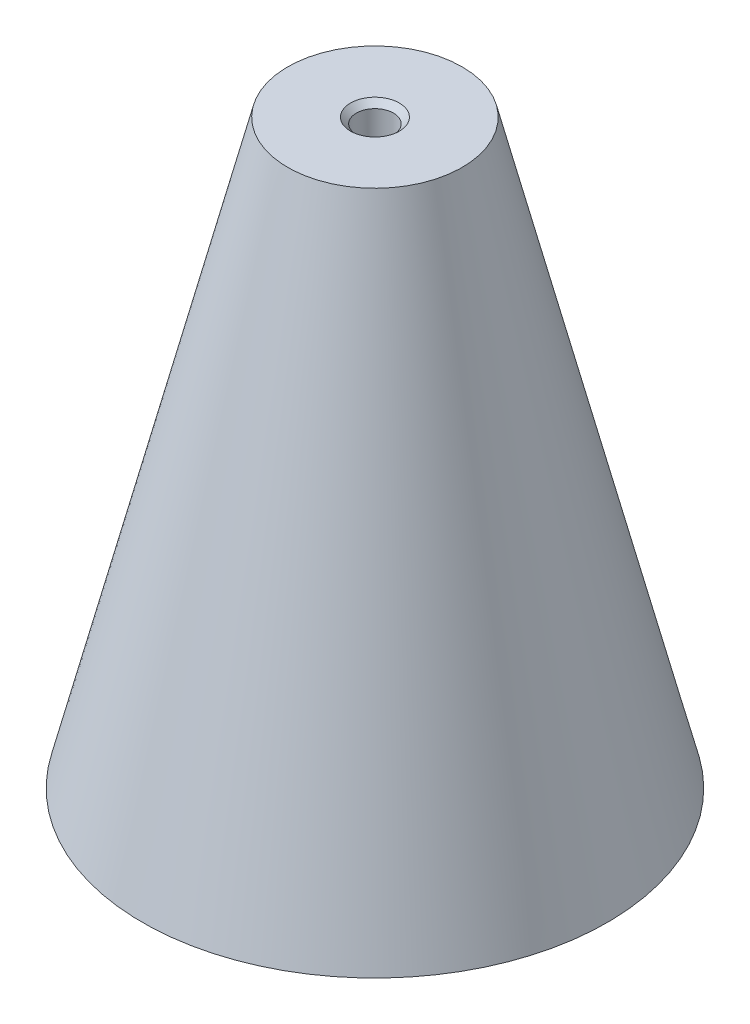
ISO-10303-21;
HEADER;
FILE_DESCRIPTION(('STEP AP214'),'2;1');
FILE_NAME('part.step','',(''),(''),'','','');
FILE_SCHEMA(('AUTOMOTIVE_DESIGN { 1 0 10303 214 1 1 1 1 }'));
ENDSEC;
DATA;
#1=APPLICATION_CONTEXT('core data for automotive mechanical design processes');
#2=APPLICATION_PROTOCOL_DEFINITION('international standard','automotive_design',2000,#1);
#3=PRODUCT_CONTEXT('',#1,'mechanical');
#4=PRODUCT('Part','Part','',(#3));
#5=PRODUCT_RELATED_PRODUCT_CATEGORY('part','',(#4));
#6=PRODUCT_DEFINITION_FORMATION('','',#4);
#7=PRODUCT_DEFINITION_CONTEXT('part definition',#1,'design');
#8=PRODUCT_DEFINITION('design','',#6,#7);
#9=PRODUCT_DEFINITION_SHAPE('','',#8);
#10=(LENGTH_UNIT() NAMED_UNIT(*) SI_UNIT(.MILLI.,.METRE.));
#11=(NAMED_UNIT(*) PLANE_ANGLE_UNIT() SI_UNIT($,.RADIAN.));
#12=(NAMED_UNIT(*) SI_UNIT($,.STERADIAN.) SOLID_ANGLE_UNIT());
#13=UNCERTAINTY_MEASURE_WITH_UNIT(LENGTH_MEASURE(1.E-05),#10,'distance_accuracy_value','');
#14=(GEOMETRIC_REPRESENTATION_CONTEXT(3) GLOBAL_UNCERTAINTY_ASSIGNED_CONTEXT((#13)) GLOBAL_UNIT_ASSIGNED_CONTEXT((#10,
#11,#12)) REPRESENTATION_CONTEXT('',''));
#15=CARTESIAN_POINT('',(0.,0.,0.));
#16=DIRECTION('',(0.,0.,1.));
#17=DIRECTION('',(1.,0.,0.));
#18=AXIS2_PLACEMENT_3D('',#15,#16,#17);
#19=CARTESIAN_POINT('',(0.,0.,0.));
#20=DIRECTION('',(0.,-1.,0.));
#21=DIRECTION('',(0.,0.,-1.));
#22=AXIS2_PLACEMENT_3D('',#19,#20,#21);
#23=CONICAL_SURFACE('',#22,7.49999999999999,0.244978663126864);
#24=CARTESIAN_POINT('',(0.,-50.,0.));
#25=DIRECTION('',(0.,-1.,0.));
#26=DIRECTION('',(0.,0.,-1.));
#27=AXIS2_PLACEMENT_3D('',#24,#25,#26);
#28=CIRCLE('',#27,20.);
#29=CARTESIAN_POINT('',(0.,-50.,-20.));
#30=VERTEX_POINT('',#29);
#31=EDGE_CURVE('E65',#30,#30,#28,.T.);
#32=ORIENTED_EDGE('',*,*,#31,.F.);
#33=EDGE_LOOP('',(#32));
#34=FACE_BOUND('',#33,.T.);
#35=CARTESIAN_POINT('',(0.,0.,0.));
#36=DIRECTION('',(0.,-1.,0.));
#37=DIRECTION('',(0.,0.,-1.));
#38=AXIS2_PLACEMENT_3D('',#35,#36,#37);
#39=CIRCLE('',#38,7.49999999999999);
#40=CARTESIAN_POINT('',(0.,0.,-7.49999999999998));
#41=VERTEX_POINT('',#40);
#42=EDGE_CURVE('E56',#41,#41,#39,.T.);
#43=ORIENTED_EDGE('',*,*,#42,.T.);
#44=EDGE_LOOP('',(#43));
#45=FACE_BOUND('',#44,.T.);
#46=ADVANCED_FACE('F35',(#34,#45),#23,.T.);
#47=CARTESIAN_POINT('',(0.,0.,7.5));
#48=DIRECTION('',(0.,-1.,0.));
#49=DIRECTION('',(0.,0.,-1.));
#50=AXIS2_PLACEMENT_3D('',#47,#48,#49);
#51=PLANE('',#50);
#52=CARTESIAN_POINT('',(0.,0.,0.));
#53=DIRECTION('',(0.,-1.,0.));
#54=DIRECTION('',(0.,0.,-1.));
#55=AXIS2_PLACEMENT_3D('',#52,#53,#54);
#56=CIRCLE('',#55,2.1);
#57=CARTESIAN_POINT('',(0.,0.,-2.1));
#58=VERTEX_POINT('',#57);
#59=EDGE_CURVE('E43',#58,#58,#56,.T.);
#60=ORIENTED_EDGE('',*,*,#59,.T.);
#61=EDGE_LOOP('',(#60));
#62=FACE_BOUND('',#61,.T.);
#63=ORIENTED_EDGE('',*,*,#42,.F.);
#64=EDGE_LOOP('',(#63));
#65=FACE_BOUND('',#64,.T.);
#66=ADVANCED_FACE('F73',(#62,#65),#51,.F.);
#67=CARTESIAN_POINT('',(0.,-4.,0.));
#68=DIRECTION('',(0.,1.,0.));
#69=DIRECTION('',(0.,0.,1.));
#70=AXIS2_PLACEMENT_3D('',#67,#68,#69);
#71=PLANE('',#70);
#72=CARTESIAN_POINT('',(0.,-4.,0.));
#73=DIRECTION('',(0.,1.,0.));
#74=DIRECTION('',(0.,0.,1.));
#75=AXIS2_PLACEMENT_3D('',#72,#73,#74);
#76=CIRCLE('',#75,2.09999999999998);
#77=CARTESIAN_POINT('',(0.,-4.,2.09999999999998));
#78=VERTEX_POINT('',#77);
#79=EDGE_CURVE('E10',#78,#78,#76,.T.);
#80=ORIENTED_EDGE('',*,*,#79,.T.);
#81=EDGE_LOOP('',(#80));
#82=FACE_BOUND('',#81,.T.);
#83=CARTESIAN_POINT('',(0.,-4.,0.));
#84=DIRECTION('',(0.,-1.,0.));
#85=DIRECTION('',(0.,0.,-1.));
#86=AXIS2_PLACEMENT_3D('',#83,#84,#85);
#87=CIRCLE('',#86,4.49999999999999);
#88=CARTESIAN_POINT('',(0.,-4.,-4.49999999999998));
#89=VERTEX_POINT('',#88);
#90=EDGE_CURVE('E59',#89,#89,#87,.T.);
#91=ORIENTED_EDGE('',*,*,#90,.T.);
#92=EDGE_LOOP('',(#91));
#93=FACE_BOUND('',#92,.T.);
#94=ADVANCED_FACE('F78',(#82,#93),#71,.F.);
#95=CARTESIAN_POINT('',(0.,-50.,0.));
#96=DIRECTION('',(0.,-1.,0.));
#97=DIRECTION('',(0.,0.,-1.));
#98=AXIS2_PLACEMENT_3D('',#95,#96,#97);
#99=CONICAL_SURFACE('',#98,16.,0.244978663126864);
#100=CARTESIAN_POINT('',(0.,-50.,0.));
#101=DIRECTION('',(0.,-1.,0.));
#102=DIRECTION('',(0.,0.,-1.));
#103=AXIS2_PLACEMENT_3D('',#100,#101,#102);
#104=CIRCLE('',#103,16.);
#105=CARTESIAN_POINT('',(0.,-50.,-16.));
#106=VERTEX_POINT('',#105);
#107=EDGE_CURVE('E62',#106,#106,#104,.T.);
#108=CARTESIAN_POINT('',(0.,-4.,-4.49999999999998));
#109=CARTESIAN_POINT('',(0.,-4.47916666666667,-4.61979166666665));
#110=CARTESIAN_POINT('',(0.,-4.95833333333334,-4.73958333333332));
#111=CARTESIAN_POINT('',(0.,-5.91666666666667,-4.97916666666665));
#112=CARTESIAN_POINT('',(0.,-6.39583333333334,-5.09895833333331));
#113=CARTESIAN_POINT('',(0.,-7.35416666666667,-5.33854166666665));
#114=CARTESIAN_POINT('',(0.,-7.83333333333334,-5.45833333333332));
#115=CARTESIAN_POINT('',(0.,-8.79166666666667,-5.69791666666665));
#116=CARTESIAN_POINT('',(0.,-9.27083333333334,-5.81770833333331));
#117=CARTESIAN_POINT('',(0.,-10.2291666666667,-6.05729166666664));
#118=CARTESIAN_POINT('',(0.,-10.7083333333333,-6.17708333333331));
#119=CARTESIAN_POINT('',(0.,-11.6666666666667,-6.41666666666664));
#120=CARTESIAN_POINT('',(0.,-12.1458333333333,-6.53645833333331));
#121=CARTESIAN_POINT('',(0.,-13.1041666666667,-6.77604166666664));
#122=CARTESIAN_POINT('',(0.,-13.5833333333333,-6.89583333333331));
#123=CARTESIAN_POINT('',(0.,-14.5416666666667,-7.13541666666664));
#124=CARTESIAN_POINT('',(0.,-15.0208333333333,-7.25520833333331));
#125=CARTESIAN_POINT('',(0.,-15.9791666666667,-7.49479166666664));
#126=CARTESIAN_POINT('',(0.,-16.4583333333333,-7.61458333333331));
#127=CARTESIAN_POINT('',(0.,-17.4166666666667,-7.85416666666664));
#128=CARTESIAN_POINT('',(0.,-17.8958333333333,-7.97395833333331));
#129=CARTESIAN_POINT('',(0.,-18.8541666666667,-8.21354166666664));
#130=CARTESIAN_POINT('',(0.,-19.3333333333333,-8.33333333333331));
#131=CARTESIAN_POINT('',(0.,-20.2916666666667,-8.57291666666664));
#132=CARTESIAN_POINT('',(0.,-20.7708333333333,-8.69270833333331));
#133=CARTESIAN_POINT('',(0.,-21.7291666666667,-8.93229166666664));
#134=CARTESIAN_POINT('',(0.,-22.2083333333333,-9.05208333333331));
#135=CARTESIAN_POINT('',(0.,-23.1666666666667,-9.29166666666664));
#136=CARTESIAN_POINT('',(0.,-23.6458333333333,-9.41145833333331));
#137=CARTESIAN_POINT('',(0.,-24.6041666666667,-9.65104166666664));
#138=CARTESIAN_POINT('',(0.,-25.0833333333333,-9.77083333333331));
#139=CARTESIAN_POINT('',(0.,-26.0416666666667,-10.0104166666666));
#140=CARTESIAN_POINT('',(0.,-26.5208333333333,-10.1302083333333));
#141=CARTESIAN_POINT('',(0.,-27.4791666666667,-10.3697916666666));
#142=CARTESIAN_POINT('',(0.,-27.9583333333333,-10.4895833333333));
#143=CARTESIAN_POINT('',(0.,-28.9166666666667,-10.7291666666666));
#144=CARTESIAN_POINT('',(0.,-29.3958333333333,-10.8489583333333));
#145=CARTESIAN_POINT('',(0.,-30.3541666666667,-11.0885416666666));
#146=CARTESIAN_POINT('',(0.,-30.8333333333333,-11.2083333333333));
#147=CARTESIAN_POINT('',(0.,-31.7916666666667,-11.4479166666666));
#148=CARTESIAN_POINT('',(0.,-32.2708333333333,-11.5677083333333));
#149=CARTESIAN_POINT('',(0.,-33.2291666666667,-11.8072916666666));
#150=CARTESIAN_POINT('',(0.,-33.7083333333333,-11.9270833333333));
#151=CARTESIAN_POINT('',(0.,-34.6666666666667,-12.1666666666666));
#152=CARTESIAN_POINT('',(0.,-35.1458333333333,-12.2864583333333));
#153=CARTESIAN_POINT('',(0.,-36.1041666666667,-12.5260416666666));
#154=CARTESIAN_POINT('',(0.,-36.5833333333333,-12.6458333333333));
#155=CARTESIAN_POINT('',(0.,-37.5416666666667,-12.8854166666666));
#156=CARTESIAN_POINT('',(0.,-38.0208333333333,-13.0052083333333));
#157=CARTESIAN_POINT('',(0.,-38.9791666666667,-13.2447916666666));
#158=CARTESIAN_POINT('',(0.,-39.4583333333333,-13.3645833333333));
#159=CARTESIAN_POINT('',(0.,-40.4166666666667,-13.6041666666666));
#160=CARTESIAN_POINT('',(0.,-40.8958333333333,-13.7239583333333));
#161=CARTESIAN_POINT('',(0.,-41.8541666666667,-13.9635416666666));
#162=CARTESIAN_POINT('',(0.,-42.3333333333334,-14.0833333333333));
#163=CARTESIAN_POINT('',(0.,-43.2916666666667,-14.3229166666666));
#164=CARTESIAN_POINT('',(0.,-43.7708333333334,-14.4427083333333));
#165=CARTESIAN_POINT('',(0.,-44.7291666666667,-14.6822916666666));
#166=CARTESIAN_POINT('',(0.,-45.2083333333333,-14.8020833333333));
#167=CARTESIAN_POINT('',(0.,-46.1666666666667,-15.0416666666666));
#168=CARTESIAN_POINT('',(0.,-46.6458333333333,-15.1614583333333));
#169=CARTESIAN_POINT('',(0.,-47.6041666666667,-15.4010416666666));
#170=CARTESIAN_POINT('',(0.,-48.0833333333333,-15.5208333333333));
#171=CARTESIAN_POINT('',(0.,-49.0416666666667,-15.7604166666666));
#172=CARTESIAN_POINT('',(0.,-49.5208333333334,-15.8802083333333));
#173=CARTESIAN_POINT('',(0.,-50.,-16.));
#174=B_SPLINE_CURVE_WITH_KNOTS('',3,(#108,#109,#110,#111,#112,#113,#114,#115,#116,#117,#118,
#119,#120,#121,#122,#123,#124,#125,#126,#127,#128,#129,#130,#131,#132,#133,#134,#135,#136,#137,
#138,#139,#140,#141,#142,#143,#144,#145,#146,#147,#148,#149,#150,#151,#152,#153,#154,#155,#156,
#157,#158,#159,#160,#161,#162,#163,#164,#165,#166,#167,#168,#169,#170,#171,#172,#173),
.UNSPECIFIED.,.F.,.F.,(4,2,2,2,2,2,2,2,2,2,2,2,2,2,2,2,2,2,2,2,2,2,2,2,2,2,2,2,2,2,2,2,4),(0.,
1.48174108420635,2.9634821684127,4.44522325261904,5.92696433682539,7.40870542103173,
8.89044650523808,10.3721875894444,11.8539286736508,13.3356697578571,14.8174108420635,
16.2991519262698,17.7808930104762,19.2626340946825,20.7443751788889,22.2261162630952,
23.7078573473016,25.1895984315079,26.6713395157143,28.1530805999206,29.6348216841269,
31.1165627683333,32.5983038525396,34.080044936746,35.5617860209523,37.0435271051587,
38.525268189365,40.0070092735714,41.4887503577777,42.9704914419841,44.4522325261904,
45.9339736103967,47.4157146946031),.UNSPECIFIED.);
#175=EDGE_CURVE('BSEAM83',#89,#106,#174,.T.);
#176=ORIENTED_EDGE('',*,*,#90,.F.);
#177=ORIENTED_EDGE('',*,*,#107,.T.);
#178=ORIENTED_EDGE('',*,*,#175,.T.);
#179=ORIENTED_EDGE('',*,*,#175,.F.);
#180=EDGE_LOOP('',(#176,#178,#177,#179));
#181=FACE_BOUND('',#180,.T.);
#182=ADVANCED_FACE('F83',(#181),#99,.F.);
#183=CARTESIAN_POINT('',(0.,-50.,16.));
#184=DIRECTION('',(0.,1.,0.));
#185=DIRECTION('',(0.,0.,1.));
#186=AXIS2_PLACEMENT_3D('',#183,#184,#185);
#187=PLANE('',#186);
#188=ORIENTED_EDGE('',*,*,#107,.F.);
#189=EDGE_LOOP('',(#188));
#190=FACE_BOUND('',#189,.T.);
#191=ORIENTED_EDGE('',*,*,#31,.T.);
#192=EDGE_LOOP('',(#191));
#193=FACE_BOUND('',#192,.T.);
#194=ADVANCED_FACE('F69',(#190,#193),#187,.F.);
#195=CARTESIAN_POINT('',(0.,-10.,0.));
#196=DIRECTION('',(0.,1.,0.));
#197=DIRECTION('',(0.,0.,1.));
#198=AXIS2_PLACEMENT_3D('',#195,#196,#197);
#199=CYLINDRICAL_SURFACE('',#198,1.6);
#200=CARTESIAN_POINT('',(0.,-0.500000000000004,0.));
#201=DIRECTION('',(0.,-1.,0.));
#202=DIRECTION('',(0.,0.,-1.));
#203=AXIS2_PLACEMENT_3D('',#200,#201,#202);
#204=CIRCLE('',#203,1.6);
#205=CARTESIAN_POINT('',(0.,-0.500000000000004,-1.6));
#206=VERTEX_POINT('',#205);
#207=EDGE_CURVE('E47',#206,#206,#204,.F.);
#208=ORIENTED_EDGE('',*,*,#207,.T.);
#209=EDGE_LOOP('',(#208));
#210=FACE_BOUND('',#209,.T.);
#211=CARTESIAN_POINT('',(0.,-3.50000000000002,0.));
#212=DIRECTION('',(0.,1.,0.));
#213=DIRECTION('',(0.,0.,1.));
#214=AXIS2_PLACEMENT_3D('',#211,#212,#213);
#215=CIRCLE('',#214,1.6);
#216=CARTESIAN_POINT('',(0.,-3.50000000000001,1.6));
#217=VERTEX_POINT('',#216);
#218=EDGE_CURVE('E51',#217,#217,#215,.F.);
#219=ORIENTED_EDGE('',*,*,#218,.T.);
#220=EDGE_LOOP('',(#219));
#221=FACE_BOUND('',#220,.T.);
#222=ADVANCED_FACE('F91',(#210,#221),#199,.F.);
#223=CARTESIAN_POINT('',(0.,-0.500000000000004,0.));
#224=DIRECTION('',(0.,1.,0.));
#225=DIRECTION('',(0.,0.,1.));
#226=AXIS2_PLACEMENT_3D('',#223,#224,#225);
#227=CONICAL_SURFACE('',#226,1.6,0.785398163397448);
#228=ORIENTED_EDGE('',*,*,#59,.F.);
#229=EDGE_LOOP('',(#228));
#230=FACE_BOUND('',#229,.T.);
#231=ORIENTED_EDGE('',*,*,#207,.F.);
#232=EDGE_LOOP('',(#231));
#233=FACE_BOUND('',#232,.T.);
#234=ADVANCED_FACE('F87',(#230,#233),#227,.F.);
#235=CARTESIAN_POINT('',(0.,-4.,0.));
#236=DIRECTION('',(0.,-1.,0.));
#237=DIRECTION('',(0.,0.,-1.));
#238=AXIS2_PLACEMENT_3D('',#235,#236,#237);
#239=CONICAL_SURFACE('',#238,2.09999999999998,0.785398163397447);
#240=ORIENTED_EDGE('',*,*,#218,.F.);
#241=EDGE_LOOP('',(#240));
#242=FACE_BOUND('',#241,.T.);
#243=ORIENTED_EDGE('',*,*,#79,.F.);
#244=EDGE_LOOP('',(#243));
#245=FACE_BOUND('',#244,.T.);
#246=ADVANCED_FACE('F38',(#242,#245),#239,.F.);
#247=CLOSED_SHELL('',(#46,#66,#94,#182,#194,#222,#234,#246));
#248=MANIFOLD_SOLID_BREP('B2',#247);
#249=ADVANCED_BREP_SHAPE_REPRESENTATION('',(#18,#248),#14);
#250=SHAPE_DEFINITION_REPRESENTATION(#9,#249);
ENDSEC;
END-ISO-10303-21;
